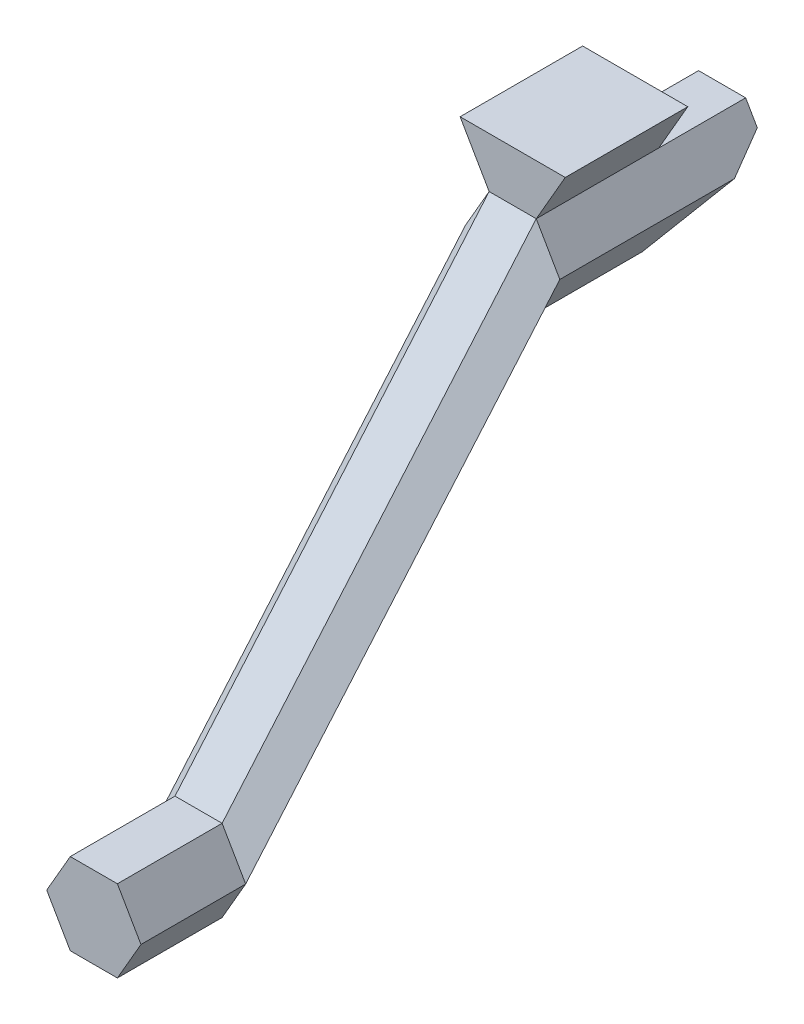
ISO-10303-21;
HEADER;
FILE_DESCRIPTION(('STEP AP214'),'2;1');
FILE_NAME('part.step','',(''),(''),'','','');
FILE_SCHEMA(('AUTOMOTIVE_DESIGN { 1 0 10303 214 1 1 1 1 }'));
ENDSEC;
DATA;
#1=APPLICATION_CONTEXT('core data for automotive mechanical design processes');
#2=APPLICATION_PROTOCOL_DEFINITION('international standard','automotive_design',2000,#1);
#3=PRODUCT_CONTEXT('',#1,'mechanical');
#4=PRODUCT('Part','Part','',(#3));
#5=PRODUCT_RELATED_PRODUCT_CATEGORY('part','',(#4));
#6=PRODUCT_DEFINITION_FORMATION('','',#4);
#7=PRODUCT_DEFINITION_CONTEXT('part definition',#1,'design');
#8=PRODUCT_DEFINITION('design','',#6,#7);
#9=PRODUCT_DEFINITION_SHAPE('','',#8);
#10=(LENGTH_UNIT() NAMED_UNIT(*) SI_UNIT(.MILLI.,.METRE.));
#11=(NAMED_UNIT(*) PLANE_ANGLE_UNIT() SI_UNIT($,.RADIAN.));
#12=(NAMED_UNIT(*) SI_UNIT($,.STERADIAN.) SOLID_ANGLE_UNIT());
#13=UNCERTAINTY_MEASURE_WITH_UNIT(LENGTH_MEASURE(1.E-05),#10,'distance_accuracy_value','');
#14=(GEOMETRIC_REPRESENTATION_CONTEXT(3) GLOBAL_UNCERTAINTY_ASSIGNED_CONTEXT((#13)) GLOBAL_UNIT_ASSIGNED_CONTEXT((#10,
#11,#12)) REPRESENTATION_CONTEXT('',''));
#15=CARTESIAN_POINT('',(0.,0.,0.));
#16=DIRECTION('',(0.,0.,1.));
#17=DIRECTION('',(1.,0.,0.));
#18=AXIS2_PLACEMENT_3D('',#15,#16,#17);
#19=CARTESIAN_POINT('',(2.85750000000006,-4.94933518262803,25.4));
#20=DIRECTION('',(-0.866025403784442,0.499999999999995,0.));
#21=DIRECTION('',(-0.499999999999995,-0.866025403784442,0.));
#22=AXIS2_PLACEMENT_3D('',#19,#20,#21);
#23=PLANE('',#22);
#24=DIRECTION('',(0.,0.,-1.));
#25=VECTOR('',#24,1.);
#26=CARTESIAN_POINT('',(2.85750000000006,-4.94933518262803,25.4));
#27=LINE('',#26,#25);
#28=CARTESIAN_POINT('',(2.85750000000002,-4.94933518262805,25.4));
#29=VERTEX_POINT('',#28);
#30=CARTESIAN_POINT('',(2.85750000000006,-4.94933518262803,12.5400000000001));
#31=VERTEX_POINT('',#30);
#32=EDGE_CURVE('E201',#29,#31,#27,.T.);
#33=ORIENTED_EDGE('',*,*,#32,.T.);
#34=DIRECTION('',(-0.283104064772028,-0.490350624014429,0.824262309000124));
#35=VECTOR('',#34,1.);
#36=CARTESIAN_POINT('',(2.39945468583216,-5.74269293893569,13.8736067378148));
#37=LINE('',#36,#35);
#38=CARTESIAN_POINT('',(5.715,0.,4.22034005493904));
#39=VERTEX_POINT('',#38);
#40=EDGE_CURVE('E367',#31,#39,#37,.F.);
#41=ORIENTED_EDGE('',*,*,#40,.T.);
#42=DIRECTION('',(0.,0.,-1.));
#43=VECTOR('',#42,1.);
#44=CARTESIAN_POINT('',(5.715,0.,25.4));
#45=LINE('',#44,#43);
#46=CARTESIAN_POINT('',(5.71499999999998,0.,25.4));
#47=VERTEX_POINT('',#46);
#48=EDGE_CURVE('E216',#47,#39,#45,.T.);
#49=ORIENTED_EDGE('',*,*,#48,.F.);
#50=DIRECTION('',(0.500000000000003,0.866025403784437,0.));
#51=VECTOR('',#50,1.);
#52=CARTESIAN_POINT('',(2.85750000000002,-4.94933518262801,25.4));
#53=LINE('',#52,#51);
#54=EDGE_CURVE('E192',#29,#47,#53,.T.);
#55=ORIENTED_EDGE('',*,*,#54,.F.);
#56=EDGE_LOOP('',(#33,#41,#49,#55));
#57=FACE_BOUND('',#56,.T.);
#58=ADVANCED_FACE('F47',(#57),#23,.F.);
#59=CARTESIAN_POINT('',(5.715,0.,25.4));
#60=DIRECTION('',(-0.866025403784438,-0.500000000000001,0.));
#61=DIRECTION('',(0.500000000000001,-0.866025403784438,0.));
#62=AXIS2_PLACEMENT_3D('',#59,#60,#61);
#63=PLANE('',#62);
#64=ORIENTED_EDGE('',*,*,#48,.T.);
#65=DIRECTION('',(0.28310406477203,-0.490350624014424,0.824262309000126));
#66=VECTOR('',#65,1.);
#67=CARTESIAN_POINT('',(7.65640937166418,-3.36261967001273,9.87278652437067));
#68=LINE('',#67,#66);
#69=CARTESIAN_POINT('',(4.26546699184535,2.51066481737201,0.));
#70=VERTEX_POINT('',#69);
#71=EDGE_CURVE('E189',#39,#70,#68,.F.);
#72=ORIENTED_EDGE('',*,*,#71,.T.);
#73=DIRECTION('',(-0.500000000000001,0.866025403784438,0.));
#74=VECTOR('',#73,1.);
#75=CARTESIAN_POINT('',(5.715,0.,0.));
#76=LINE('',#75,#74);
#77=CARTESIAN_POINT('',(2.85749999999999,4.94933518262807,0.));
#78=VERTEX_POINT('',#77);
#79=EDGE_CURVE('E181',#70,#78,#76,.T.);
#80=ORIENTED_EDGE('',*,*,#79,.T.);
#81=DIRECTION('',(0.,0.,-1.));
#82=VECTOR('',#81,1.);
#83=CARTESIAN_POINT('',(2.85749999999999,4.94933518262807,10.16));
#84=LINE('',#83,#82);
#85=CARTESIAN_POINT('',(2.85749999999999,4.94933518262807,10.541));
#86=VERTEX_POINT('',#85);
#87=EDGE_CURVE('E65',#86,#78,#84,.T.);
#88=ORIENTED_EDGE('',*,*,#87,.F.);
#89=DIRECTION('',(0.,0.,-1.));
#90=VECTOR('',#89,1.);
#91=CARTESIAN_POINT('',(2.85749999999999,4.94933518262807,25.4));
#92=LINE('',#91,#90);
#93=CARTESIAN_POINT('',(2.85749999999999,4.94933518262807,25.4));
#94=VERTEX_POINT('',#93);
#95=EDGE_CURVE('E214',#94,#86,#92,.T.);
#96=ORIENTED_EDGE('',*,*,#95,.F.);
#97=DIRECTION('',(-0.499999999999991,0.866025403784444,0.));
#98=VECTOR('',#97,1.);
#99=CARTESIAN_POINT('',(5.71499999999994,0.,25.4));
#100=LINE('',#99,#98);
#101=EDGE_CURVE('E221',#47,#94,#100,.T.);
#102=ORIENTED_EDGE('',*,*,#101,.F.);
#103=EDGE_LOOP('',(#64,#72,#80,#88,#96,#102));
#104=FACE_BOUND('',#103,.T.);
#105=ADVANCED_FACE('F187',(#104),#63,.F.);
#106=CARTESIAN_POINT('',(-2.85750000000002,4.94933518262805,25.4));
#107=DIRECTION('',(0.866025403784441,-0.499999999999995,0.));
#108=DIRECTION('',(0.499999999999995,0.866025403784441,0.));
#109=AXIS2_PLACEMENT_3D('',#106,#107,#108);
#110=PLANE('',#109);
#111=DIRECTION('',(-0.499999999999995,-0.866025403784441,0.));
#112=VECTOR('',#111,1.);
#113=CARTESIAN_POINT('',(-2.85750000000002,4.94933518262805,0.));
#114=LINE('',#113,#112);
#115=CARTESIAN_POINT('',(-2.85750000000002,4.94933518262805,0.));
#116=VERTEX_POINT('',#115);
#117=CARTESIAN_POINT('',(-4.2654669918454,2.51066481737192,0.));
#118=VERTEX_POINT('',#117);
#119=EDGE_CURVE('E184',#116,#118,#114,.T.);
#120=ORIENTED_EDGE('',*,*,#119,.T.);
#121=DIRECTION('',(0.283104064772028,0.490350624014429,-0.824262309000124));
#122=VECTOR('',#121,1.);
#123=CARTESIAN_POINT('',(-8.11445468583209,-4.15597742632049,11.2063932621853));
#124=LINE('',#123,#122);
#125=CARTESIAN_POINT('',(-5.715,0.,4.2203400549389));
#126=VERTEX_POINT('',#125);
#127=EDGE_CURVE('E372',#118,#126,#124,.F.);
#128=ORIENTED_EDGE('',*,*,#127,.T.);
#129=DIRECTION('',(0.,0.,-1.));
#130=VECTOR('',#129,1.);
#131=CARTESIAN_POINT('',(-5.715,0.,25.4));
#132=LINE('',#131,#130);
#133=CARTESIAN_POINT('',(-5.715,0.,25.4));
#134=VERTEX_POINT('',#133);
#135=EDGE_CURVE('E208',#134,#126,#132,.T.);
#136=ORIENTED_EDGE('',*,*,#135,.F.);
#137=DIRECTION('',(-0.499999999999995,-0.866025403784441,0.));
#138=VECTOR('',#137,1.);
#139=CARTESIAN_POINT('',(-2.85750000000002,4.94933518262805,25.4));
#140=LINE('',#139,#138);
#141=CARTESIAN_POINT('',(-2.85750000000002,4.94933518262806,25.4));
#142=VERTEX_POINT('',#141);
#143=EDGE_CURVE('E227',#142,#134,#140,.T.);
#144=ORIENTED_EDGE('',*,*,#143,.F.);
#145=DIRECTION('',(0.,0.,-1.));
#146=VECTOR('',#145,1.);
#147=CARTESIAN_POINT('',(-2.85750000000002,4.94933518262805,25.4));
#148=LINE('',#147,#146);
#149=CARTESIAN_POINT('',(-2.85750000000002,4.94933518262805,10.541));
#150=VERTEX_POINT('',#149);
#151=EDGE_CURVE('E211',#142,#150,#148,.T.);
#152=ORIENTED_EDGE('',*,*,#151,.T.);
#153=DIRECTION('',(0.,0.,-1.));
#154=VECTOR('',#153,1.);
#155=CARTESIAN_POINT('',(-2.85750000000002,4.94933518262805,10.16));
#156=LINE('',#155,#154);
#157=EDGE_CURVE('E174',#150,#116,#156,.T.);
#158=ORIENTED_EDGE('',*,*,#157,.T.);
#159=EDGE_LOOP('',(#120,#128,#136,#144,#152,#158));
#160=FACE_BOUND('',#159,.T.);
#161=ADVANCED_FACE('F413',(#160),#110,.F.);
#162=CARTESIAN_POINT('',(-5.715,0.,25.4));
#163=DIRECTION('',(0.866025403784434,0.500000000000007,0.));
#164=DIRECTION('',(-0.500000000000007,0.866025403784435,0.));
#165=AXIS2_PLACEMENT_3D('',#162,#163,#164);
#166=PLANE('',#165);
#167=ORIENTED_EDGE('',*,*,#135,.T.);
#168=DIRECTION('',(-0.283104064772034,0.490350624014424,-0.824262309000125));
#169=VECTOR('',#168,1.);
#170=CARTESIAN_POINT('',(-2.85749999999995,-4.94933518262809,12.5400000000001));
#171=LINE('',#170,#169);
#172=CARTESIAN_POINT('',(-2.85749999999995,-4.94933518262809,12.5400000000001));
#173=VERTEX_POINT('',#172);
#174=EDGE_CURVE('E374',#126,#173,#171,.F.);
#175=ORIENTED_EDGE('',*,*,#174,.T.);
#176=DIRECTION('',(0.,0.,-1.));
#177=VECTOR('',#176,1.);
#178=CARTESIAN_POINT('',(-2.85749999999995,-4.94933518262809,25.4));
#179=LINE('',#178,#177);
#180=CARTESIAN_POINT('',(-2.85749999999995,-4.94933518262809,25.4));
#181=VERTEX_POINT('',#180);
#182=EDGE_CURVE('E204',#181,#173,#179,.T.);
#183=ORIENTED_EDGE('',*,*,#182,.F.);
#184=DIRECTION('',(0.500000000000007,-0.866025403784435,0.));
#185=VECTOR('',#184,1.);
#186=CARTESIAN_POINT('',(-5.715,0.,25.4));
#187=LINE('',#186,#185);
#188=EDGE_CURVE('E224',#134,#181,#187,.T.);
#189=ORIENTED_EDGE('',*,*,#188,.F.);
#190=EDGE_LOOP('',(#167,#175,#183,#189));
#191=FACE_BOUND('',#190,.T.);
#192=ADVANCED_FACE('F753',(#191),#166,.F.);
#193=CARTESIAN_POINT('',(-2.85749999999995,-4.94933518262809,25.4));
#194=DIRECTION('',(0.,1.,0.));
#195=DIRECTION('',(-1.,0.,0.));
#196=AXIS2_PLACEMENT_3D('',#193,#194,#195);
#197=PLANE('',#196);
#198=ORIENTED_EDGE('',*,*,#182,.T.);
#199=DIRECTION('',(1.,0.,0.));
#200=VECTOR('',#199,1.);
#201=CARTESIAN_POINT('',(-2.85749999999995,-4.94933518262809,12.5400000000001));
#202=LINE('',#201,#200);
#203=EDGE_CURVE('E218',#173,#31,#202,.T.);
#204=ORIENTED_EDGE('',*,*,#203,.T.);
#205=ORIENTED_EDGE('',*,*,#32,.F.);
#206=DIRECTION('',(1.,0.,0.));
#207=VECTOR('',#206,1.);
#208=CARTESIAN_POINT('',(-1.01546060534387E-13,-4.94933518262808,25.4));
#209=LINE('',#208,#207);
#210=EDGE_CURVE('E205',#181,#29,#209,.T.);
#211=ORIENTED_EDGE('',*,*,#210,.F.);
#212=EDGE_LOOP('',(#198,#204,#205,#211));
#213=FACE_BOUND('',#212,.T.);
#214=ADVANCED_FACE('F669',(#213),#197,.F.);
#215=CARTESIAN_POINT('',(0.,0.,0.));
#216=DIRECTION('',(0.,0.,1.));
#217=DIRECTION('',(1.,0.,0.));
#218=AXIS2_PLACEMENT_3D('',#215,#216,#217);
#219=PLANE('',#218);
#220=ORIENTED_EDGE('',*,*,#119,.F.);
#221=DIRECTION('',(-1.,0.,0.));
#222=VECTOR('',#221,1.);
#223=CARTESIAN_POINT('',(-2.85750000000002,4.94933518262805,0.));
#224=LINE('',#223,#222);
#225=EDGE_CURVE('E170',#78,#116,#224,.T.);
#226=ORIENTED_EDGE('',*,*,#225,.F.);
#227=ORIENTED_EDGE('',*,*,#79,.F.);
#228=DIRECTION('',(-1.,0.,0.));
#229=VECTOR('',#228,1.);
#230=CARTESIAN_POINT('',(0.,2.51066481737196,0.));
#231=LINE('',#230,#229);
#232=EDGE_CURVE('E370',#70,#118,#231,.T.);
#233=ORIENTED_EDGE('',*,*,#232,.T.);
#234=EDGE_LOOP('',(#220,#226,#227,#233));
#235=FACE_BOUND('',#234,.T.);
#236=ADVANCED_FACE('F180',(#235),#219,.F.);
#237=CARTESIAN_POINT('',(-6.37581244308027,3.68107703031502,4.29458986870087));
#238=DIRECTION('',(-0.748054471431039,0.43188945044922,0.503871025524092));
#239=DIRECTION('',(0.558660819127343,0.,0.82939621965136));
#240=AXIS2_PLACEMENT_3D('',#237,#238,#239);
#241=PLANE('',#240);
#242=DIRECTION('',(0.,-0.759256602365298,0.650791373455967));
#243=VECTOR('',#242,1.);
#244=CARTESIAN_POINT('',(5.715,0.,25.4));
#245=LINE('',#244,#243);
#246=CARTESIAN_POINT('',(5.71499999999999,-44.4500000000002,63.5));
#247=VERTEX_POINT('',#246);
#248=EDGE_CURVE('E537',#47,#247,#245,.T.);
#249=ORIENTED_EDGE('',*,*,#248,.T.);
#250=DIRECTION('',(0.500000000000006,0.866025403784435,0.));
#251=VECTOR('',#250,1.);
#252=CARTESIAN_POINT('',(23.5336645991093,-13.5871675913144,63.5));
#253=LINE('',#252,#251);
#254=CARTESIAN_POINT('',(2.85750000000006,-49.399335182628,63.5));
#255=VERTEX_POINT('',#254);
#256=EDGE_CURVE('E190',#255,#247,#253,.T.);
#257=ORIENTED_EDGE('',*,*,#256,.F.);
#258=DIRECTION('',(0.,-0.759256602365297,0.650791373455969));
#259=VECTOR('',#258,1.);
#260=CARTESIAN_POINT('',(2.85750000000006,-4.94933518262803,25.4));
#261=LINE('',#260,#259);
#262=EDGE_CURVE('E435',#29,#255,#261,.T.);
#263=ORIENTED_EDGE('',*,*,#262,.F.);
#264=ORIENTED_EDGE('',*,*,#54,.T.);
#265=EDGE_LOOP('',(#249,#257,#263,#264));
#266=FACE_BOUND('',#265,.T.);
#267=ADVANCED_FACE('F454',(#266),#241,.F.);
#268=CARTESIAN_POINT('',(-1.01546060534387E-13,10.4543992167693,12.1967990862308));
#269=DIRECTION('',(0.,0.650791373455969,0.759256602365297));
#270=DIRECTION('',(0.,-0.759256602365297,0.650791373455969));
#271=AXIS2_PLACEMENT_3D('',#268,#269,#270);
#272=PLANE('',#271);
#273=ORIENTED_EDGE('',*,*,#262,.T.);
#274=DIRECTION('',(1.,0.,0.));
#275=VECTOR('',#274,1.);
#276=CARTESIAN_POINT('',(4.79827465624927E-13,-49.3993351826281,63.5));
#277=LINE('',#276,#275);
#278=CARTESIAN_POINT('',(-2.85749999999995,-49.3993351826281,63.5));
#279=VERTEX_POINT('',#278);
#280=EDGE_CURVE('E357',#279,#255,#277,.T.);
#281=ORIENTED_EDGE('',*,*,#280,.F.);
#282=DIRECTION('',(0.,-0.759256602365297,0.650791373455969));
#283=VECTOR('',#282,1.);
#284=CARTESIAN_POINT('',(-2.85749999999995,-4.94933518262809,25.4));
#285=LINE('',#284,#283);
#286=EDGE_CURVE('E361',#181,#279,#285,.T.);
#287=ORIENTED_EDGE('',*,*,#286,.F.);
#288=ORIENTED_EDGE('',*,*,#210,.T.);
#289=EDGE_LOOP('',(#273,#281,#287,#288));
#290=FACE_BOUND('',#289,.T.);
#291=ADVANCED_FACE('F462',(#290),#272,.F.);
#292=CARTESIAN_POINT('',(12.771874619246,7.37384524947759,8.60281945772386));
#293=DIRECTION('',(-0.748054471431055,-0.431889450449209,-0.503871025524077));
#294=DIRECTION('',(-0.558660819127323,0.,0.829396219651373));
#295=AXIS2_PLACEMENT_3D('',#292,#293,#294);
#296=PLANE('',#295);
#297=DIRECTION('',(0.,-0.759256602365297,0.650791373455969));
#298=VECTOR('',#297,1.);
#299=CARTESIAN_POINT('',(2.85749999999999,4.94933518262807,25.4));
#300=LINE('',#299,#298);
#301=CARTESIAN_POINT('',(2.85749999999998,-39.5006648173719,63.5));
#302=VERTEX_POINT('',#301);
#303=EDGE_CURVE('E426',#94,#302,#300,.T.);
#304=ORIENTED_EDGE('',*,*,#303,.T.);
#305=DIRECTION('',(-0.499999999999988,0.866025403784446,0.));
#306=VECTOR('',#305,1.);
#307=CARTESIAN_POINT('',(-14.9611645991089,-8.63783240868552,63.5));
#308=LINE('',#307,#306);
#309=EDGE_CURVE('E195',#247,#302,#308,.T.);
#310=ORIENTED_EDGE('',*,*,#309,.F.);
#311=ORIENTED_EDGE('',*,*,#248,.F.);
#312=ORIENTED_EDGE('',*,*,#101,.T.);
#313=EDGE_LOOP('',(#304,#310,#311,#312));
#314=FACE_BOUND('',#313,.T.);
#315=ADVANCED_FACE('F466',(#314),#296,.F.);
#316=CARTESIAN_POINT('',(0.,14.6467772538189,17.0879067961221));
#317=DIRECTION('',(0.,-0.650791373455969,-0.759256602365296));
#318=DIRECTION('',(0.,0.759256602365296,-0.650791373455969));
#319=AXIS2_PLACEMENT_3D('',#316,#317,#318);
#320=PLANE('',#319);
#321=DIRECTION('',(0.,-0.759256602365296,0.650791373455969));
#322=VECTOR('',#321,1.);
#323=CARTESIAN_POINT('',(-2.85750000000002,4.94933518262805,25.4));
#324=LINE('',#323,#322);
#325=CARTESIAN_POINT('',(-2.85750000000002,-39.5006648173719,63.5));
#326=VERTEX_POINT('',#325);
#327=EDGE_CURVE('E424',#142,#326,#324,.T.);
#328=ORIENTED_EDGE('',*,*,#327,.T.);
#329=DIRECTION('',(-1.,0.,0.));
#330=VECTOR('',#329,1.);
#331=CARTESIAN_POINT('',(0.,-39.5006648173719,63.5));
#332=LINE('',#331,#330);
#333=EDGE_CURVE('E287',#302,#326,#332,.T.);
#334=ORIENTED_EDGE('',*,*,#333,.F.);
#335=ORIENTED_EDGE('',*,*,#303,.F.);
#336=DIRECTION('',(1.,0.,0.));
#337=VECTOR('',#336,1.);
#338=CARTESIAN_POINT('',(0.,4.94933518262806,25.4));
#339=LINE('',#338,#337);
#340=EDGE_CURVE('E230',#94,#142,#339,.F.);
#341=ORIENTED_EDGE('',*,*,#340,.T.);
#342=EDGE_LOOP('',(#328,#334,#335,#341));
#343=FACE_BOUND('',#342,.T.);
#344=ADVANCED_FACE('F423',(#343),#320,.F.);
#345=CARTESIAN_POINT('',(-12.771874619246,7.37384524947774,8.60281945772402));
#346=DIRECTION('',(0.748054471431049,-0.431889450449214,-0.503871025524082));
#347=DIRECTION('',(-0.55866081912733,0.,-0.829396219651368));
#348=AXIS2_PLACEMENT_3D('',#345,#346,#347);
#349=PLANE('',#348);
#350=DIRECTION('',(0.,-0.759256602365296,0.650791373455969));
#351=VECTOR('',#350,1.);
#352=CARTESIAN_POINT('',(-5.715,0.,25.4));
#353=LINE('',#352,#351);
#354=CARTESIAN_POINT('',(-5.71499999999999,-44.45,63.5));
#355=VERTEX_POINT('',#354);
#356=EDGE_CURVE('E432',#134,#355,#353,.T.);
#357=ORIENTED_EDGE('',*,*,#356,.T.);
#358=DIRECTION('',(-0.499999999999995,-0.866025403784442,0.));
#359=VECTOR('',#358,1.);
#360=CARTESIAN_POINT('',(14.961164599109,-8.63783240868577,63.5));
#361=LINE('',#360,#359);
#362=EDGE_CURVE('E280',#326,#355,#361,.T.);
#363=ORIENTED_EDGE('',*,*,#362,.F.);
#364=ORIENTED_EDGE('',*,*,#327,.F.);
#365=ORIENTED_EDGE('',*,*,#143,.T.);
#366=EDGE_LOOP('',(#357,#363,#364,#365));
#367=FACE_BOUND('',#366,.T.);
#368=ADVANCED_FACE('F430',(#367),#349,.F.);
#369=CARTESIAN_POINT('',(6.37581244308026,3.68107703031502,4.29458986870085));
#370=DIRECTION('',(0.748054471431038,0.431889450449221,0.503871025524091));
#371=DIRECTION('',(0.558660819127342,0.,-0.82939621965136));
#372=AXIS2_PLACEMENT_3D('',#369,#370,#371);
#373=PLANE('',#372);
#374=ORIENTED_EDGE('',*,*,#286,.T.);
#375=DIRECTION('',(0.500000000000007,-0.866025403784435,0.));
#376=VECTOR('',#375,1.);
#377=CARTESIAN_POINT('',(-23.5336645991093,-13.5871675913144,63.5));
#378=LINE('',#377,#376);
#379=EDGE_CURVE('E247',#355,#279,#378,.T.);
#380=ORIENTED_EDGE('',*,*,#379,.F.);
#381=ORIENTED_EDGE('',*,*,#356,.F.);
#382=ORIENTED_EDGE('',*,*,#188,.T.);
#383=EDGE_LOOP('',(#374,#380,#381,#382));
#384=FACE_BOUND('',#383,.T.);
#385=ADVANCED_FACE('F503',(#384),#373,.F.);
#386=CARTESIAN_POINT('',(4.79827465624927E-13,-49.3993351826281,76.2));
#387=DIRECTION('',(0.,1.,0.));
#388=DIRECTION('',(-1.,0.,0.));
#389=AXIS2_PLACEMENT_3D('',#386,#387,#388);
#390=PLANE('',#389);
#391=ORIENTED_EDGE('',*,*,#280,.T.);
#392=DIRECTION('',(0.,0.,-1.));
#393=VECTOR('',#392,1.);
#394=CARTESIAN_POINT('',(2.85750000000006,-49.399335182628,76.2));
#395=LINE('',#394,#393);
#396=CARTESIAN_POINT('',(2.85750000000006,-49.399335182628,76.2));
#397=VERTEX_POINT('',#396);
#398=EDGE_CURVE('E347',#397,#255,#395,.T.);
#399=ORIENTED_EDGE('',*,*,#398,.F.);
#400=DIRECTION('',(1.,0.,0.));
#401=VECTOR('',#400,1.);
#402=CARTESIAN_POINT('',(4.79827465624927E-13,-49.3993351826281,76.2));
#403=LINE('',#402,#401);
#404=CARTESIAN_POINT('',(-2.85749999999995,-49.3993351826281,76.2));
#405=VERTEX_POINT('',#404);
#406=EDGE_CURVE('E523',#405,#397,#403,.T.);
#407=ORIENTED_EDGE('',*,*,#406,.F.);
#408=DIRECTION('',(0.,0.,-1.));
#409=VECTOR('',#408,1.);
#410=CARTESIAN_POINT('',(-2.85749999999995,-49.3993351826281,76.2));
#411=LINE('',#410,#409);
#412=EDGE_CURVE('E235',#405,#279,#411,.T.);
#413=ORIENTED_EDGE('',*,*,#412,.T.);
#414=EDGE_LOOP('',(#391,#399,#407,#413));
#415=FACE_BOUND('',#414,.T.);
#416=ADVANCED_FACE('F331',(#415),#390,.F.);
#417=CARTESIAN_POINT('',(23.5336645991093,-13.5871675913144,76.2));
#418=DIRECTION('',(-0.866025403784435,0.500000000000006,0.));
#419=DIRECTION('',(-0.500000000000006,-0.866025403784435,0.));
#420=AXIS2_PLACEMENT_3D('',#417,#418,#419);
#421=PLANE('',#420);
#422=ORIENTED_EDGE('',*,*,#256,.T.);
#423=DIRECTION('',(0.,0.,-1.));
#424=VECTOR('',#423,1.);
#425=CARTESIAN_POINT('',(5.71499999999999,-44.4500000000002,76.2));
#426=LINE('',#425,#424);
#427=CARTESIAN_POINT('',(5.71499999999999,-44.4500000000002,76.2));
#428=VERTEX_POINT('',#427);
#429=EDGE_CURVE('E306',#428,#247,#426,.T.);
#430=ORIENTED_EDGE('',*,*,#429,.F.);
#431=DIRECTION('',(0.500000000000006,0.866025403784435,0.));
#432=VECTOR('',#431,1.);
#433=CARTESIAN_POINT('',(23.5336645991093,-13.5871675913144,76.2));
#434=LINE('',#433,#432);
#435=EDGE_CURVE('E547',#397,#428,#434,.T.);
#436=ORIENTED_EDGE('',*,*,#435,.F.);
#437=ORIENTED_EDGE('',*,*,#398,.T.);
#438=EDGE_LOOP('',(#422,#430,#436,#437));
#439=FACE_BOUND('',#438,.T.);
#440=ADVANCED_FACE('F327',(#439),#421,.F.);
#441=CARTESIAN_POINT('',(-14.9611645991089,-8.63783240868552,76.2));
#442=DIRECTION('',(-0.866025403784446,-0.499999999999988,0.));
#443=DIRECTION('',(0.499999999999988,-0.866025403784446,0.));
#444=AXIS2_PLACEMENT_3D('',#441,#442,#443);
#445=PLANE('',#444);
#446=ORIENTED_EDGE('',*,*,#309,.T.);
#447=DIRECTION('',(0.,0.,-1.));
#448=VECTOR('',#447,1.);
#449=CARTESIAN_POINT('',(2.85749999999998,-39.5006648173719,76.2));
#450=LINE('',#449,#448);
#451=CARTESIAN_POINT('',(2.85749999999998,-39.5006648173719,76.2));
#452=VERTEX_POINT('',#451);
#453=EDGE_CURVE('E303',#452,#302,#450,.T.);
#454=ORIENTED_EDGE('',*,*,#453,.F.);
#455=DIRECTION('',(-0.499999999999988,0.866025403784446,0.));
#456=VECTOR('',#455,1.);
#457=CARTESIAN_POINT('',(-14.9611645991089,-8.63783240868552,76.2));
#458=LINE('',#457,#456);
#459=EDGE_CURVE('E546',#428,#452,#458,.T.);
#460=ORIENTED_EDGE('',*,*,#459,.F.);
#461=ORIENTED_EDGE('',*,*,#429,.T.);
#462=EDGE_LOOP('',(#446,#454,#460,#461));
#463=FACE_BOUND('',#462,.T.);
#464=ADVANCED_FACE('F318',(#463),#445,.F.);
#465=CARTESIAN_POINT('',(0.,-39.5006648173719,76.2));
#466=DIRECTION('',(0.,-1.,0.));
#467=DIRECTION('',(1.,0.,0.));
#468=AXIS2_PLACEMENT_3D('',#465,#466,#467);
#469=PLANE('',#468);
#470=ORIENTED_EDGE('',*,*,#333,.T.);
#471=DIRECTION('',(0.,0.,-1.));
#472=VECTOR('',#471,1.);
#473=CARTESIAN_POINT('',(-2.85750000000002,-39.5006648173719,76.2));
#474=LINE('',#473,#472);
#475=CARTESIAN_POINT('',(-2.85750000000002,-39.5006648173719,76.2));
#476=VERTEX_POINT('',#475);
#477=EDGE_CURVE('E288',#476,#326,#474,.T.);
#478=ORIENTED_EDGE('',*,*,#477,.F.);
#479=DIRECTION('',(-1.,0.,0.));
#480=VECTOR('',#479,1.);
#481=CARTESIAN_POINT('',(0.,-39.5006648173719,76.2));
#482=LINE('',#481,#480);
#483=EDGE_CURVE('E529',#452,#476,#482,.T.);
#484=ORIENTED_EDGE('',*,*,#483,.F.);
#485=ORIENTED_EDGE('',*,*,#453,.T.);
#486=EDGE_LOOP('',(#470,#478,#484,#485));
#487=FACE_BOUND('',#486,.T.);
#488=ADVANCED_FACE('F269',(#487),#469,.F.);
#489=CARTESIAN_POINT('',(14.961164599109,-8.63783240868577,76.2));
#490=DIRECTION('',(0.866025403784441,-0.499999999999995,0.));
#491=DIRECTION('',(0.499999999999995,0.866025403784442,0.));
#492=AXIS2_PLACEMENT_3D('',#489,#490,#491);
#493=PLANE('',#492);
#494=ORIENTED_EDGE('',*,*,#362,.T.);
#495=DIRECTION('',(0.,0.,-1.));
#496=VECTOR('',#495,1.);
#497=CARTESIAN_POINT('',(-5.71499999999999,-44.45,76.2));
#498=LINE('',#497,#496);
#499=CARTESIAN_POINT('',(-5.71499999999999,-44.45,76.2));
#500=VERTEX_POINT('',#499);
#501=EDGE_CURVE('E238',#500,#355,#498,.T.);
#502=ORIENTED_EDGE('',*,*,#501,.F.);
#503=DIRECTION('',(-0.499999999999995,-0.866025403784442,0.));
#504=VECTOR('',#503,1.);
#505=CARTESIAN_POINT('',(14.961164599109,-8.63783240868577,76.2));
#506=LINE('',#505,#504);
#507=EDGE_CURVE('E527',#476,#500,#506,.T.);
#508=ORIENTED_EDGE('',*,*,#507,.F.);
#509=ORIENTED_EDGE('',*,*,#477,.T.);
#510=EDGE_LOOP('',(#494,#502,#508,#509));
#511=FACE_BOUND('',#510,.T.);
#512=ADVANCED_FACE('F264',(#511),#493,.F.);
#513=CARTESIAN_POINT('',(-23.5336645991093,-13.5871675913144,76.2));
#514=DIRECTION('',(0.866025403784435,0.500000000000007,0.));
#515=DIRECTION('',(-0.500000000000007,0.866025403784435,0.));
#516=AXIS2_PLACEMENT_3D('',#513,#514,#515);
#517=PLANE('',#516);
#518=ORIENTED_EDGE('',*,*,#379,.T.);
#519=ORIENTED_EDGE('',*,*,#412,.F.);
#520=DIRECTION('',(0.500000000000007,-0.866025403784435,0.));
#521=VECTOR('',#520,1.);
#522=CARTESIAN_POINT('',(-23.5336645991093,-13.5871675913144,76.2));
#523=LINE('',#522,#521);
#524=EDGE_CURVE('E239',#500,#405,#523,.T.);
#525=ORIENTED_EDGE('',*,*,#524,.F.);
#526=ORIENTED_EDGE('',*,*,#501,.T.);
#527=EDGE_LOOP('',(#518,#519,#525,#526));
#528=FACE_BOUND('',#527,.T.);
#529=ADVANCED_FACE('F253',(#528),#517,.F.);
#530=CARTESIAN_POINT('',(0.,0.,76.2));
#531=DIRECTION('',(0.,0.,1.));
#532=DIRECTION('',(1.,0.,0.));
#533=AXIS2_PLACEMENT_3D('',#530,#531,#532);
#534=PLANE('',#533);
#535=ORIENTED_EDGE('',*,*,#406,.T.);
#536=ORIENTED_EDGE('',*,*,#435,.T.);
#537=ORIENTED_EDGE('',*,*,#459,.T.);
#538=ORIENTED_EDGE('',*,*,#483,.T.);
#539=ORIENTED_EDGE('',*,*,#507,.T.);
#540=ORIENTED_EDGE('',*,*,#524,.T.);
#541=EDGE_LOOP('',(#535,#536,#537,#538,#539,#540));
#542=FACE_BOUND('',#541,.T.);
#543=ADVANCED_FACE('F263',(#542),#534,.T.);
#544=CARTESIAN_POINT('',(6.37702724097991,11.045335182628,25.4));
#545=DIRECTION('',(0.86602540378444,-0.499999999999998,0.));
#546=DIRECTION('',(0.499999999999998,0.86602540378444,0.));
#547=AXIS2_PLACEMENT_3D('',#544,#545,#546);
#548=PLANE('',#547);
#549=ORIENTED_EDGE('',*,*,#95,.T.);
#550=DIRECTION('',(0.499999999999998,0.86602540378444,0.));
#551=VECTOR('',#550,1.);
#552=CARTESIAN_POINT('',(6.37702724097991,11.045335182628,10.541));
#553=LINE('',#552,#551);
#554=CARTESIAN_POINT('',(6.37702724097991,11.045335182628,10.541));
#555=VERTEX_POINT('',#554);
#556=EDGE_CURVE('E383',#86,#555,#553,.T.);
#557=ORIENTED_EDGE('',*,*,#556,.T.);
#558=DIRECTION('',(0.,0.,-1.));
#559=VECTOR('',#558,1.);
#560=CARTESIAN_POINT('',(6.37702724097991,11.045335182628,25.4));
#561=LINE('',#560,#559);
#562=CARTESIAN_POINT('',(6.37702724097991,11.045335182628,25.4));
#563=VERTEX_POINT('',#562);
#564=EDGE_CURVE('E549',#563,#555,#561,.T.);
#565=ORIENTED_EDGE('',*,*,#564,.F.);
#566=DIRECTION('',(-0.499999999999998,-0.86602540378444,0.));
#567=VECTOR('',#566,1.);
#568=CARTESIAN_POINT('',(6.37702724097991,11.045335182628,25.4));
#569=LINE('',#568,#567);
#570=EDGE_CURVE('E787',#563,#94,#569,.T.);
#571=ORIENTED_EDGE('',*,*,#570,.T.);
#572=EDGE_LOOP('',(#549,#557,#565,#571));
#573=FACE_BOUND('',#572,.T.);
#574=ADVANCED_FACE('F598',(#573),#548,.T.);
#575=CARTESIAN_POINT('',(-6.37702724097996,11.0453351826281,25.4));
#576=DIRECTION('',(0.,1.,0.));
#577=DIRECTION('',(-1.,0.,0.));
#578=AXIS2_PLACEMENT_3D('',#575,#576,#577);
#579=PLANE('',#578);
#580=ORIENTED_EDGE('',*,*,#564,.T.);
#581=DIRECTION('',(-1.,0.,0.));
#582=VECTOR('',#581,1.);
#583=CARTESIAN_POINT('',(-6.37702724097996,11.0453351826281,10.541));
#584=LINE('',#583,#582);
#585=CARTESIAN_POINT('',(-6.37702724097996,11.0453351826281,10.541));
#586=VERTEX_POINT('',#585);
#587=EDGE_CURVE('E388',#555,#586,#584,.T.);
#588=ORIENTED_EDGE('',*,*,#587,.T.);
#589=DIRECTION('',(0.,0.,-1.));
#590=VECTOR('',#589,1.);
#591=CARTESIAN_POINT('',(-6.37702724097996,11.0453351826281,25.4));
#592=LINE('',#591,#590);
#593=CARTESIAN_POINT('',(-6.37702724097996,11.0453351826281,25.4));
#594=VERTEX_POINT('',#593);
#595=EDGE_CURVE('E411',#594,#586,#592,.T.);
#596=ORIENTED_EDGE('',*,*,#595,.F.);
#597=DIRECTION('',(1.,0.,0.));
#598=VECTOR('',#597,1.);
#599=CARTESIAN_POINT('',(-6.37702724097996,11.0453351826281,25.4));
#600=LINE('',#599,#598);
#601=EDGE_CURVE('E790',#594,#563,#600,.T.);
#602=ORIENTED_EDGE('',*,*,#601,.T.);
#603=EDGE_LOOP('',(#580,#588,#596,#602));
#604=FACE_BOUND('',#603,.T.);
#605=ADVANCED_FACE('F601',(#604),#579,.T.);
#606=CARTESIAN_POINT('',(-2.85750000000002,4.94933518262805,25.4));
#607=DIRECTION('',(-0.86602540378444,-0.499999999999998,0.));
#608=DIRECTION('',(0.499999999999998,-0.86602540378444,0.));
#609=AXIS2_PLACEMENT_3D('',#606,#607,#608);
#610=PLANE('',#609);
#611=ORIENTED_EDGE('',*,*,#595,.T.);
#612=DIRECTION('',(0.499999999999998,-0.86602540378444,0.));
#613=VECTOR('',#612,1.);
#614=CARTESIAN_POINT('',(-2.85750000000002,4.94933518262805,10.541));
#615=LINE('',#614,#613);
#616=EDGE_CURVE('E385',#586,#150,#615,.T.);
#617=ORIENTED_EDGE('',*,*,#616,.T.);
#618=ORIENTED_EDGE('',*,*,#151,.F.);
#619=DIRECTION('',(-0.499999999999998,0.86602540378444,0.));
#620=VECTOR('',#619,1.);
#621=CARTESIAN_POINT('',(-2.85750000000002,4.94933518262805,25.4));
#622=LINE('',#621,#620);
#623=EDGE_CURVE('E792',#142,#594,#622,.T.);
#624=ORIENTED_EDGE('',*,*,#623,.T.);
#625=EDGE_LOOP('',(#611,#617,#618,#624));
#626=FACE_BOUND('',#625,.T.);
#627=ADVANCED_FACE('F408',(#626),#610,.T.);
#628=CARTESIAN_POINT('',(0.,0.,25.4));
#629=DIRECTION('',(0.,0.,-1.));
#630=DIRECTION('',(-1.,0.,0.));
#631=AXIS2_PLACEMENT_3D('',#628,#629,#630);
#632=PLANE('',#631);
#633=ORIENTED_EDGE('',*,*,#340,.F.);
#634=ORIENTED_EDGE('',*,*,#570,.F.);
#635=ORIENTED_EDGE('',*,*,#601,.F.);
#636=ORIENTED_EDGE('',*,*,#623,.F.);
#637=EDGE_LOOP('',(#633,#634,#635,#636));
#638=FACE_BOUND('',#637,.T.);
#639=ADVANCED_FACE('F577',(#638),#632,.F.);
#640=CARTESIAN_POINT('',(-2.85749999999995,-4.94933518262809,12.5400000000001));
#641=DIRECTION('',(0.,0.859421950806478,0.511266965950264));
#642=DIRECTION('',(1.,0.,0.));
#643=AXIS2_PLACEMENT_3D('',#640,#641,#642);
#644=PLANE('',#643);
#645=ORIENTED_EDGE('',*,*,#127,.F.);
#646=ORIENTED_EDGE('',*,*,#232,.F.);
#647=ORIENTED_EDGE('',*,*,#71,.F.);
#648=ORIENTED_EDGE('',*,*,#40,.F.);
#649=ORIENTED_EDGE('',*,*,#203,.F.);
#650=ORIENTED_EDGE('',*,*,#174,.F.);
#651=EDGE_LOOP('',(#645,#646,#647,#648,#649,#650));
#652=FACE_BOUND('',#651,.T.);
#653=ADVANCED_FACE('F574',(#652),#644,.F.);
#654=CARTESIAN_POINT('',(-2.85750000000002,4.94933518262805,10.16));
#655=DIRECTION('',(0.,-1.,0.));
#656=DIRECTION('',(1.,0.,0.));
#657=AXIS2_PLACEMENT_3D('',#654,#655,#656);
#658=PLANE('',#657);
#659=ORIENTED_EDGE('',*,*,#225,.T.);
#660=ORIENTED_EDGE('',*,*,#157,.F.);
#661=DIRECTION('',(0.755928946018453,0.,-0.654653670707978));
#662=VECTOR('',#661,1.);
#663=CARTESIAN_POINT('',(-2.66895389780466,4.94933518262805,10.3777142857143));
#664=LINE('',#663,#662);
#665=CARTESIAN_POINT('',(-2.41755909487752,4.94933518262805,10.16));
#666=VERTEX_POINT('',#665);
#667=EDGE_CURVE('E12',#150,#666,#664,.T.);
#668=ORIENTED_EDGE('',*,*,#667,.T.);
#669=DIRECTION('',(-1.,0.,0.));
#670=VECTOR('',#669,1.);
#671=CARTESIAN_POINT('',(-2.85750000000002,4.94933518262805,10.16));
#672=LINE('',#671,#670);
#673=CARTESIAN_POINT('',(2.41755909487748,4.94933518262807,10.16));
#674=VERTEX_POINT('',#673);
#675=EDGE_CURVE('E175',#674,#666,#672,.T.);
#676=ORIENTED_EDGE('',*,*,#675,.F.);
#677=DIRECTION('',(0.755928946018456,0.,0.654653670707975));
#678=VECTOR('',#677,1.);
#679=CARTESIAN_POINT('',(-0.596760387909676,4.94933518262806,7.54952275278396));
#680=LINE('',#679,#678);
#681=EDGE_CURVE('E57',#674,#86,#680,.T.);
#682=ORIENTED_EDGE('',*,*,#681,.T.);
#683=ORIENTED_EDGE('',*,*,#87,.T.);
#684=EDGE_LOOP('',(#659,#660,#668,#676,#682,#683));
#685=FACE_BOUND('',#684,.T.);
#686=ADVANCED_FACE('F168',(#685),#658,.F.);
#687=CARTESIAN_POINT('',(0.,0.,10.16));
#688=DIRECTION('',(0.,0.,1.));
#689=DIRECTION('',(1.,0.,0.));
#690=AXIS2_PLACEMENT_3D('',#687,#688,#689);
#691=PLANE('',#690);
#692=DIRECTION('',(1.,0.,0.));
#693=VECTOR('',#692,1.);
#694=CARTESIAN_POINT('',(6.37702724097991,10.664335182628,10.16));
#695=LINE('',#694,#693);
#696=CARTESIAN_POINT('',(-5.71711588329621,10.664335182628,10.16));
#697=VERTEX_POINT('',#696);
#698=CARTESIAN_POINT('',(5.71711588329616,10.664335182628,10.16));
#699=VERTEX_POINT('',#698);
#700=EDGE_CURVE('E376',#697,#699,#695,.T.);
#701=ORIENTED_EDGE('',*,*,#700,.T.);
#702=DIRECTION('',(-0.499999999999998,-0.86602540378444,0.));
#703=VECTOR('',#702,1.);
#704=CARTESIAN_POINT('',(2.52754432115811,5.13983518262808,10.16));
#705=LINE('',#704,#703);
#706=EDGE_CURVE('E380',#699,#674,#705,.T.);
#707=ORIENTED_EDGE('',*,*,#706,.T.);
#708=ORIENTED_EDGE('',*,*,#675,.T.);
#709=DIRECTION('',(-0.499999999999998,0.86602540378444,0.));
#710=VECTOR('',#709,1.);
#711=CARTESIAN_POINT('',(-6.04707156213808,11.2358351826281,10.16));
#712=LINE('',#711,#710);
#713=EDGE_CURVE('E378',#666,#697,#712,.T.);
#714=ORIENTED_EDGE('',*,*,#713,.T.);
#715=EDGE_LOOP('',(#701,#707,#708,#714));
#716=FACE_BOUND('',#715,.T.);
#717=ADVANCED_FACE('F585',(#716),#691,.F.);
#718=CARTESIAN_POINT('',(0.329955678841841,0.190499999999982,10.16));
#719=DIRECTION('',(-0.612372435695795,-0.353553390593272,-0.707106781186548));
#720=DIRECTION('',(0.499999999999998,-0.86602540378444,0.));
#721=AXIS2_PLACEMENT_3D('',#718,#719,#720);
#722=PLANE('',#721);
#723=ORIENTED_EDGE('',*,*,#667,.F.);
#724=ORIENTED_EDGE('',*,*,#616,.F.);
#725=DIRECTION('',(-0.774596669241482,0.447213595499959,0.447213595499958));
#726=VECTOR('',#725,1.);
#727=CARTESIAN_POINT('',(-2.28684635331849,8.68386814610243,8.17953296347439));
#728=LINE('',#727,#726);
#729=EDGE_CURVE('E51',#697,#586,#728,.T.);
#730=ORIENTED_EDGE('',*,*,#729,.F.);
#731=ORIENTED_EDGE('',*,*,#713,.F.);
#732=EDGE_LOOP('',(#723,#724,#730,#731));
#733=FACE_BOUND('',#732,.T.);
#734=ADVANCED_FACE('F49',(#733),#722,.T.);
#735=CARTESIAN_POINT('',(0.,10.664335182628,10.16));
#736=DIRECTION('',(0.,0.707106781186547,-0.707106781186548));
#737=DIRECTION('',(-1.,0.,0.));
#738=AXIS2_PLACEMENT_3D('',#735,#736,#737);
#739=PLANE('',#738);
#740=ORIENTED_EDGE('',*,*,#729,.T.);
#741=ORIENTED_EDGE('',*,*,#587,.F.);
#742=DIRECTION('',(-0.774596669241483,-0.447213595499959,-0.447213595499958));
#743=VECTOR('',#742,1.);
#744=CARTESIAN_POINT('',(2.28684635331847,8.68386814610245,8.17953296347441));
#745=LINE('',#744,#743);
#746=EDGE_CURVE('E390',#699,#555,#745,.F.);
#747=ORIENTED_EDGE('',*,*,#746,.F.);
#748=ORIENTED_EDGE('',*,*,#700,.F.);
#749=EDGE_LOOP('',(#740,#741,#747,#748));
#750=FACE_BOUND('',#749,.T.);
#751=ADVANCED_FACE('F400',(#750),#739,.T.);
#752=CARTESIAN_POINT('',(-0.329955678841878,0.190500000000003,10.16));
#753=DIRECTION('',(0.612372435695794,-0.353553390593272,-0.707106781186549));
#754=DIRECTION('',(0.499999999999998,0.86602540378444,0.));
#755=AXIS2_PLACEMENT_3D('',#752,#753,#754);
#756=PLANE('',#755);
#757=ORIENTED_EDGE('',*,*,#746,.T.);
#758=ORIENTED_EDGE('',*,*,#556,.F.);
#759=ORIENTED_EDGE('',*,*,#681,.F.);
#760=ORIENTED_EDGE('',*,*,#706,.F.);
#761=EDGE_LOOP('',(#757,#758,#759,#760));
#762=FACE_BOUND('',#761,.T.);
#763=ADVANCED_FACE('F579',(#762),#756,.T.);
#764=CLOSED_SHELL('',(#58,#105,#161,#192,#214,#236,#267,#291,#315,#344,#368,#385,#416,#440,#464,
#488,#512,#529,#543,#574,#605,#627,#639,#653,#686,#717,#734,#751,#763));
#765=MANIFOLD_SOLID_BREP('B2',#764);
#766=ADVANCED_BREP_SHAPE_REPRESENTATION('',(#18,#765),#14);
#767=SHAPE_DEFINITION_REPRESENTATION(#9,#766);
ENDSEC;
END-ISO-10303-21;
